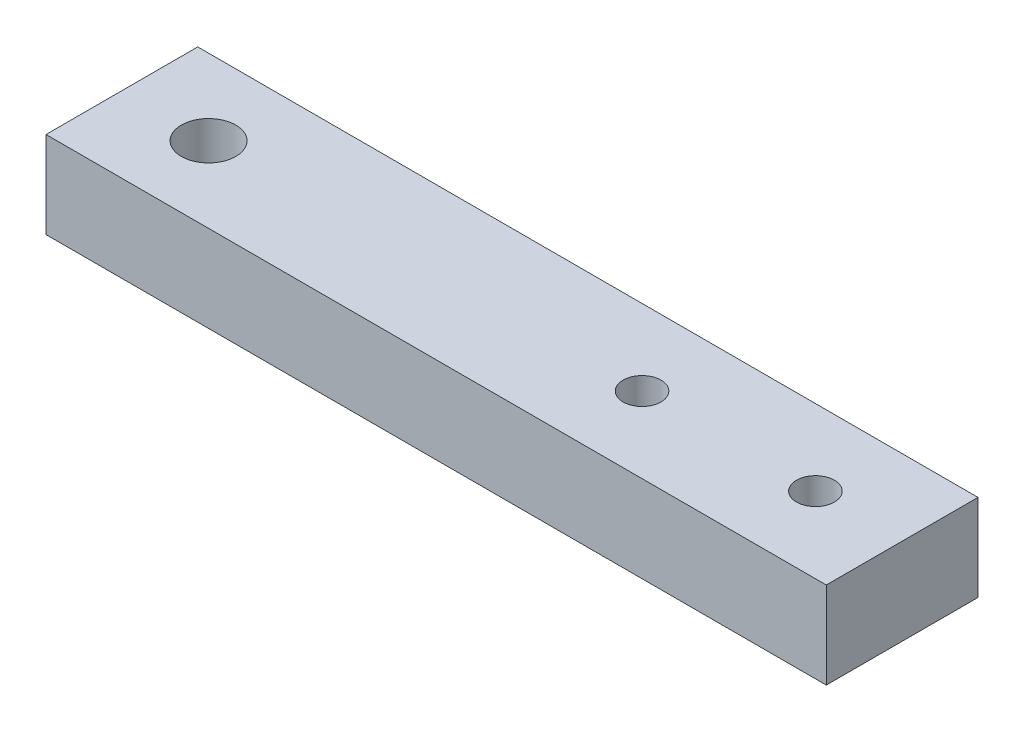
ISO-10303-21;
HEADER;
FILE_DESCRIPTION(('STEP AP214'),'2;1');
FILE_NAME('part.step','',(''),(''),'','','');
FILE_SCHEMA(('AUTOMOTIVE_DESIGN { 1 0 10303 214 1 1 1 1 }'));
ENDSEC;
DATA;
#1=APPLICATION_CONTEXT('core data for automotive mechanical design processes');
#2=APPLICATION_PROTOCOL_DEFINITION('international standard','automotive_design',2000,#1);
#3=PRODUCT_CONTEXT('',#1,'mechanical');
#4=PRODUCT('Part','Part','',(#3));
#5=PRODUCT_RELATED_PRODUCT_CATEGORY('part','',(#4));
#6=PRODUCT_DEFINITION_FORMATION('','',#4);
#7=PRODUCT_DEFINITION_CONTEXT('part definition',#1,'design');
#8=PRODUCT_DEFINITION('design','',#6,#7);
#9=PRODUCT_DEFINITION_SHAPE('','',#8);
#10=(LENGTH_UNIT() NAMED_UNIT(*) SI_UNIT(.MILLI.,.METRE.));
#11=(NAMED_UNIT(*) PLANE_ANGLE_UNIT() SI_UNIT($,.RADIAN.));
#12=(NAMED_UNIT(*) SI_UNIT($,.STERADIAN.) SOLID_ANGLE_UNIT());
#13=UNCERTAINTY_MEASURE_WITH_UNIT(LENGTH_MEASURE(1.E-05),#10,'distance_accuracy_value','');
#14=(GEOMETRIC_REPRESENTATION_CONTEXT(3) GLOBAL_UNCERTAINTY_ASSIGNED_CONTEXT((#13)) GLOBAL_UNIT_ASSIGNED_CONTEXT((#10,
#11,#12)) REPRESENTATION_CONTEXT('',''));
#15=CARTESIAN_POINT('',(0.,0.,0.));
#16=DIRECTION('',(0.,0.,1.));
#17=DIRECTION('',(1.,0.,0.));
#18=AXIS2_PLACEMENT_3D('',#15,#16,#17);
#19=CARTESIAN_POINT('',(0.,6.34999999999999,0.));
#20=DIRECTION('',(1.,0.,0.));
#21=DIRECTION('',(0.,0.,-1.));
#22=AXIS2_PLACEMENT_3D('',#19,#20,#21);
#23=PLANE('',#22);
#24=DIRECTION('',(0.,0.,1.));
#25=VECTOR('',#24,1.);
#26=CARTESIAN_POINT('',(0.,0.,0.));
#27=LINE('',#26,#25);
#28=CARTESIAN_POINT('',(0.,0.,-304.8));
#29=VERTEX_POINT('',#28);
#30=CARTESIAN_POINT('',(0.,0.,-293.6875));
#31=VERTEX_POINT('',#30);
#32=EDGE_CURVE('E115',#29,#31,#27,.T.);
#33=ORIENTED_EDGE('',*,*,#32,.T.);
#34=DIRECTION('',(0.,1.,0.));
#35=VECTOR('',#34,1.);
#36=CARTESIAN_POINT('',(0.,0.,-293.6875));
#37=LINE('',#36,#35);
#38=CARTESIAN_POINT('',(0.,6.34999999999999,-293.6875));
#39=VERTEX_POINT('',#38);
#40=EDGE_CURVE('E60',#31,#39,#37,.T.);
#41=ORIENTED_EDGE('',*,*,#40,.T.);
#42=DIRECTION('',(0.,0.,1.));
#43=VECTOR('',#42,1.);
#44=CARTESIAN_POINT('',(0.,6.34999999999999,0.));
#45=LINE('',#44,#43);
#46=CARTESIAN_POINT('',(0.,6.34999999999999,-304.8));
#47=VERTEX_POINT('',#46);
#48=EDGE_CURVE('E117',#47,#39,#45,.T.);
#49=ORIENTED_EDGE('',*,*,#48,.F.);
#50=DIRECTION('',(0.,-1.,0.));
#51=VECTOR('',#50,1.);
#52=CARTESIAN_POINT('',(0.,6.34999999999999,-304.8));
#53=LINE('',#52,#51);
#54=EDGE_CURVE('E13',#47,#29,#53,.T.);
#55=ORIENTED_EDGE('',*,*,#54,.T.);
#56=EDGE_LOOP('',(#33,#41,#49,#55));
#57=FACE_BOUND('',#56,.T.);
#58=ADVANCED_FACE('F46',(#57),#23,.F.);
#59=CARTESIAN_POINT('',(0.,6.34999999999999,-304.8));
#60=DIRECTION('',(0.,0.,1.));
#61=DIRECTION('',(1.,0.,0.));
#62=AXIS2_PLACEMENT_3D('',#59,#60,#61);
#63=PLANE('',#62);
#64=DIRECTION('',(-1.,0.,0.));
#65=VECTOR('',#64,1.);
#66=CARTESIAN_POINT('',(0.,6.34999999999999,-304.8));
#67=LINE('',#66,#65);
#68=CARTESIAN_POINT('',(57.15,6.34999999999999,-304.8));
#69=VERTEX_POINT('',#68);
#70=EDGE_CURVE('E53',#69,#47,#67,.T.);
#71=ORIENTED_EDGE('',*,*,#70,.F.);
#72=DIRECTION('',(0.,1.,0.));
#73=VECTOR('',#72,1.);
#74=CARTESIAN_POINT('',(57.15,0.,-304.8));
#75=LINE('',#74,#73);
#76=CARTESIAN_POINT('',(57.15,0.,-304.8));
#77=VERTEX_POINT('',#76);
#78=EDGE_CURVE('E113',#77,#69,#75,.T.);
#79=ORIENTED_EDGE('',*,*,#78,.F.);
#80=DIRECTION('',(-1.,0.,0.));
#81=VECTOR('',#80,1.);
#82=CARTESIAN_POINT('',(0.,0.,-304.8));
#83=LINE('',#82,#81);
#84=EDGE_CURVE('E103',#77,#29,#83,.T.);
#85=ORIENTED_EDGE('',*,*,#84,.T.);
#86=ORIENTED_EDGE('',*,*,#54,.F.);
#87=EDGE_LOOP('',(#71,#79,#85,#86));
#88=FACE_BOUND('',#87,.T.);
#89=ADVANCED_FACE('F121',(#88),#63,.F.);
#90=CARTESIAN_POINT('',(0.,6.34999999999999,0.));
#91=DIRECTION('',(0.,-1.,0.));
#92=DIRECTION('',(0.,0.,-1.));
#93=AXIS2_PLACEMENT_3D('',#90,#91,#92);
#94=PLANE('',#93);
#95=CARTESIAN_POINT('',(6.34999999999999,6.34999999999999,-299.24375));
#96=DIRECTION('',(0.,1.,0.));
#97=DIRECTION('',(0.,0.,1.));
#98=AXIS2_PLACEMENT_3D('',#95,#96,#97);
#99=CIRCLE('',#98,1.99389999999999);
#100=CARTESIAN_POINT('',(6.34999999999999,6.34999999999999,-297.24985));
#101=VERTEX_POINT('',#100);
#102=EDGE_CURVE('E191',#101,#101,#99,.T.);
#103=ORIENTED_EDGE('',*,*,#102,.F.);
#104=EDGE_LOOP('',(#103));
#105=FACE_BOUND('',#104,.T.);
#106=CARTESIAN_POINT('',(50.8,6.35000000000002,-299.24375));
#107=DIRECTION('',(0.,1.,0.));
#108=DIRECTION('',(0.,0.,1.));
#109=AXIS2_PLACEMENT_3D('',#106,#107,#108);
#110=CIRCLE('',#109,1.38906249999998);
#111=CARTESIAN_POINT('',(50.8,6.35000000000002,-297.8546875));
#112=VERTEX_POINT('',#111);
#113=EDGE_CURVE('E196',#112,#112,#110,.T.);
#114=ORIENTED_EDGE('',*,*,#113,.F.);
#115=EDGE_LOOP('',(#114));
#116=FACE_BOUND('',#115,.T.);
#117=CARTESIAN_POINT('',(38.1,6.34999999999999,-299.24375));
#118=DIRECTION('',(0.,1.,0.));
#119=DIRECTION('',(0.,0.,1.));
#120=AXIS2_PLACEMENT_3D('',#117,#118,#119);
#121=CIRCLE('',#120,1.38906249999997);
#122=CARTESIAN_POINT('',(38.1,6.34999999999999,-297.8546875));
#123=VERTEX_POINT('',#122);
#124=EDGE_CURVE('E108',#123,#123,#121,.T.);
#125=ORIENTED_EDGE('',*,*,#124,.F.);
#126=EDGE_LOOP('',(#125));
#127=FACE_BOUND('',#126,.T.);
#128=DIRECTION('',(-1.,0.,0.));
#129=VECTOR('',#128,1.);
#130=CARTESIAN_POINT('',(57.15,6.34999999999999,-293.6875));
#131=LINE('',#130,#129);
#132=CARTESIAN_POINT('',(57.15,6.34999999999999,-293.6875));
#133=VERTEX_POINT('',#132);
#134=EDGE_CURVE('E104',#133,#39,#131,.T.);
#135=ORIENTED_EDGE('',*,*,#134,.F.);
#136=DIRECTION('',(0.,0.,1.));
#137=VECTOR('',#136,1.);
#138=CARTESIAN_POINT('',(57.15,6.34999999999999,-304.8));
#139=LINE('',#138,#137);
#140=EDGE_CURVE('E92',#69,#133,#139,.T.);
#141=ORIENTED_EDGE('',*,*,#140,.F.);
#142=ORIENTED_EDGE('',*,*,#70,.T.);
#143=ORIENTED_EDGE('',*,*,#48,.T.);
#144=EDGE_LOOP('',(#135,#141,#142,#143));
#145=FACE_BOUND('',#144,.T.);
#146=ADVANCED_FACE('F124',(#105,#116,#127,#145),#94,.F.);
#147=CARTESIAN_POINT('',(0.,0.,0.));
#148=DIRECTION('',(0.,-1.,0.));
#149=DIRECTION('',(0.,0.,-1.));
#150=AXIS2_PLACEMENT_3D('',#147,#148,#149);
#151=PLANE('',#150);
#152=CARTESIAN_POINT('',(6.35,0.,-299.24375));
#153=DIRECTION('',(0.,1.,0.));
#154=DIRECTION('',(0.,0.,1.));
#155=AXIS2_PLACEMENT_3D('',#152,#153,#154);
#156=CIRCLE('',#155,1.99389999999999);
#157=CARTESIAN_POINT('',(6.35,0.,-297.24985));
#158=VERTEX_POINT('',#157);
#159=EDGE_CURVE('E111',#158,#158,#156,.T.);
#160=ORIENTED_EDGE('',*,*,#159,.T.);
#161=EDGE_LOOP('',(#160));
#162=FACE_BOUND('',#161,.T.);
#163=CARTESIAN_POINT('',(50.8,0.,-299.24375));
#164=DIRECTION('',(0.,1.,0.));
#165=DIRECTION('',(0.,0.,1.));
#166=AXIS2_PLACEMENT_3D('',#163,#164,#165);
#167=CIRCLE('',#166,1.38906249999998);
#168=CARTESIAN_POINT('',(50.8,0.,-297.8546875));
#169=VERTEX_POINT('',#168);
#170=EDGE_CURVE('E192',#169,#169,#167,.T.);
#171=ORIENTED_EDGE('',*,*,#170,.T.);
#172=EDGE_LOOP('',(#171));
#173=FACE_BOUND('',#172,.T.);
#174=CARTESIAN_POINT('',(38.1,0.,-299.24375));
#175=DIRECTION('',(0.,1.,0.));
#176=DIRECTION('',(0.,0.,1.));
#177=AXIS2_PLACEMENT_3D('',#174,#175,#176);
#178=CIRCLE('',#177,1.38906249999997);
#179=CARTESIAN_POINT('',(38.1,0.,-297.8546875));
#180=VERTEX_POINT('',#179);
#181=EDGE_CURVE('E200',#180,#180,#178,.T.);
#182=ORIENTED_EDGE('',*,*,#181,.T.);
#183=EDGE_LOOP('',(#182));
#184=FACE_BOUND('',#183,.T.);
#185=DIRECTION('',(0.,0.,1.));
#186=VECTOR('',#185,1.);
#187=CARTESIAN_POINT('',(57.15,0.,-304.8));
#188=LINE('',#187,#186);
#189=CARTESIAN_POINT('',(57.15,0.,-293.6875));
#190=VERTEX_POINT('',#189);
#191=EDGE_CURVE('E90',#77,#190,#188,.T.);
#192=ORIENTED_EDGE('',*,*,#191,.T.);
#193=DIRECTION('',(-1.,0.,0.));
#194=VECTOR('',#193,1.);
#195=CARTESIAN_POINT('',(57.15,0.,-293.6875));
#196=LINE('',#195,#194);
#197=EDGE_CURVE('E94',#190,#31,#196,.T.);
#198=ORIENTED_EDGE('',*,*,#197,.T.);
#199=ORIENTED_EDGE('',*,*,#32,.F.);
#200=ORIENTED_EDGE('',*,*,#84,.F.);
#201=EDGE_LOOP('',(#192,#198,#199,#200));
#202=FACE_BOUND('',#201,.T.);
#203=ADVANCED_FACE('F102',(#162,#173,#184,#202),#151,.T.);
#204=CARTESIAN_POINT('',(57.15,0.,-304.8));
#205=DIRECTION('',(-1.,0.,0.));
#206=DIRECTION('',(0.,0.,1.));
#207=AXIS2_PLACEMENT_3D('',#204,#205,#206);
#208=PLANE('',#207);
#209=ORIENTED_EDGE('',*,*,#140,.T.);
#210=DIRECTION('',(0.,1.,0.));
#211=VECTOR('',#210,1.);
#212=CARTESIAN_POINT('',(57.15,0.,-293.6875));
#213=LINE('',#212,#211);
#214=EDGE_CURVE('E87',#190,#133,#213,.T.);
#215=ORIENTED_EDGE('',*,*,#214,.F.);
#216=ORIENTED_EDGE('',*,*,#191,.F.);
#217=ORIENTED_EDGE('',*,*,#78,.T.);
#218=EDGE_LOOP('',(#209,#215,#216,#217));
#219=FACE_BOUND('',#218,.T.);
#220=ADVANCED_FACE('F88',(#219),#208,.F.);
#221=CARTESIAN_POINT('',(57.15,0.,-293.6875));
#222=DIRECTION('',(0.,0.,-1.));
#223=DIRECTION('',(-1.,0.,0.));
#224=AXIS2_PLACEMENT_3D('',#221,#222,#223);
#225=PLANE('',#224);
#226=ORIENTED_EDGE('',*,*,#134,.T.);
#227=ORIENTED_EDGE('',*,*,#40,.F.);
#228=ORIENTED_EDGE('',*,*,#197,.F.);
#229=ORIENTED_EDGE('',*,*,#214,.T.);
#230=EDGE_LOOP('',(#226,#227,#228,#229));
#231=FACE_BOUND('',#230,.T.);
#232=ADVANCED_FACE('F96',(#231),#225,.F.);
#233=CARTESIAN_POINT('',(38.1,0.,-299.24375));
#234=DIRECTION('',(0.,1.,0.));
#235=DIRECTION('',(0.,0.,1.));
#236=AXIS2_PLACEMENT_3D('',#233,#234,#235);
#237=CYLINDRICAL_SURFACE('',#236,1.38906249999997);
#238=ORIENTED_EDGE('',*,*,#181,.F.);
#239=EDGE_LOOP('',(#238));
#240=FACE_BOUND('',#239,.T.);
#241=ORIENTED_EDGE('',*,*,#124,.T.);
#242=EDGE_LOOP('',(#241));
#243=FACE_BOUND('',#242,.T.);
#244=ADVANCED_FACE('F162',(#240,#243),#237,.F.);
#245=CARTESIAN_POINT('',(50.8,0.,-299.24375));
#246=DIRECTION('',(0.,1.,0.));
#247=DIRECTION('',(0.,0.,1.));
#248=AXIS2_PLACEMENT_3D('',#245,#246,#247);
#249=CYLINDRICAL_SURFACE('',#248,1.38906249999998);
#250=ORIENTED_EDGE('',*,*,#170,.F.);
#251=EDGE_LOOP('',(#250));
#252=FACE_BOUND('',#251,.T.);
#253=ORIENTED_EDGE('',*,*,#113,.T.);
#254=EDGE_LOOP('',(#253));
#255=FACE_BOUND('',#254,.T.);
#256=ADVANCED_FACE('F169',(#252,#255),#249,.F.);
#257=CARTESIAN_POINT('',(6.35,0.,-299.24375));
#258=DIRECTION('',(0.,1.,0.));
#259=DIRECTION('',(0.,0.,1.));
#260=AXIS2_PLACEMENT_3D('',#257,#258,#259);
#261=CYLINDRICAL_SURFACE('',#260,1.99389999999999);
#262=ORIENTED_EDGE('',*,*,#159,.F.);
#263=EDGE_LOOP('',(#262));
#264=FACE_BOUND('',#263,.T.);
#265=ORIENTED_EDGE('',*,*,#102,.T.);
#266=EDGE_LOOP('',(#265));
#267=FACE_BOUND('',#266,.T.);
#268=ADVANCED_FACE('F177',(#264,#267),#261,.F.);
#269=CLOSED_SHELL('',(#58,#89,#146,#203,#220,#232,#244,#256,#268));
#270=MANIFOLD_SOLID_BREP('B2',#269);
#271=ADVANCED_BREP_SHAPE_REPRESENTATION('',(#18,#270),#14);
#272=SHAPE_DEFINITION_REPRESENTATION(#9,#271);
ENDSEC;
END-ISO-10303-21;
